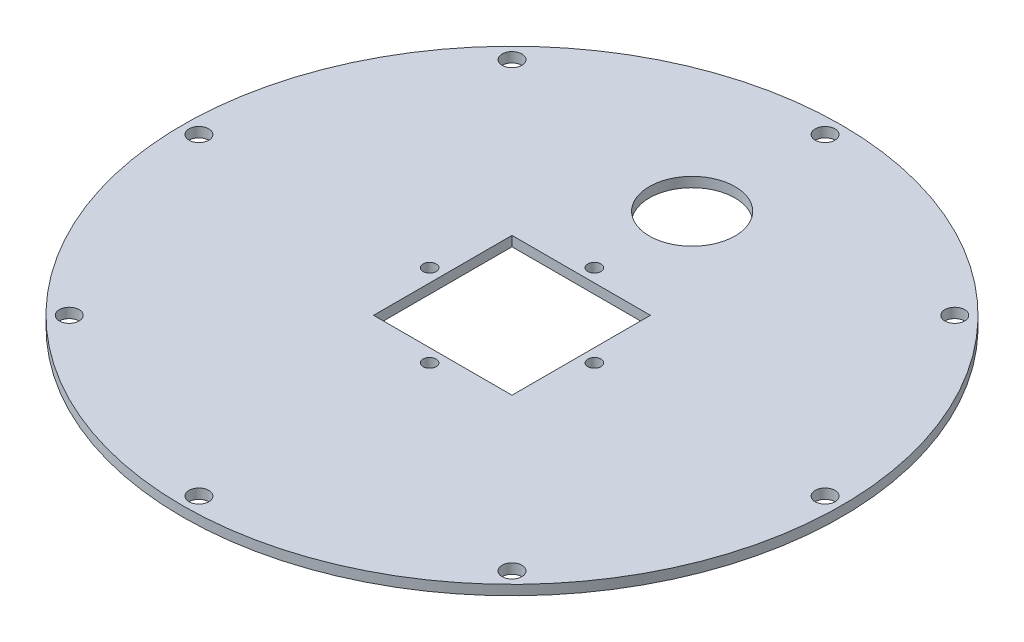
ISO-10303-21;
HEADER;
FILE_DESCRIPTION(('STEP AP214'),'2;1');
FILE_NAME('part.step','',(''),(''),'','','');
FILE_SCHEMA(('AUTOMOTIVE_DESIGN { 1 0 10303 214 1 1 1 1 }'));
ENDSEC;
DATA;
#1=APPLICATION_CONTEXT('core data for automotive mechanical design processes');
#2=APPLICATION_PROTOCOL_DEFINITION('international standard','automotive_design',2000,#1);
#3=PRODUCT_CONTEXT('',#1,'mechanical');
#4=PRODUCT('Part','Part','',(#3));
#5=PRODUCT_RELATED_PRODUCT_CATEGORY('part','',(#4));
#6=PRODUCT_DEFINITION_FORMATION('','',#4);
#7=PRODUCT_DEFINITION_CONTEXT('part definition',#1,'design');
#8=PRODUCT_DEFINITION('design','',#6,#7);
#9=PRODUCT_DEFINITION_SHAPE('','',#8);
#10=(LENGTH_UNIT() NAMED_UNIT(*) SI_UNIT(.MILLI.,.METRE.));
#11=(NAMED_UNIT(*) PLANE_ANGLE_UNIT() SI_UNIT($,.RADIAN.));
#12=(NAMED_UNIT(*) SI_UNIT($,.STERADIAN.) SOLID_ANGLE_UNIT());
#13=UNCERTAINTY_MEASURE_WITH_UNIT(LENGTH_MEASURE(1.E-05),#10,'distance_accuracy_value','');
#14=(GEOMETRIC_REPRESENTATION_CONTEXT(3) GLOBAL_UNCERTAINTY_ASSIGNED_CONTEXT((#13)) GLOBAL_UNIT_ASSIGNED_CONTEXT((#10,
#11,#12)) REPRESENTATION_CONTEXT('',''));
#15=CARTESIAN_POINT('',(0.,0.,0.));
#16=DIRECTION('',(0.,0.,1.));
#17=DIRECTION('',(1.,0.,0.));
#18=AXIS2_PLACEMENT_3D('',#15,#16,#17);
#19=CARTESIAN_POINT('',(0.,2.99999999999999,0.));
#20=DIRECTION('',(0.,1.,0.));
#21=DIRECTION('',(0.,0.,1.));
#22=AXIS2_PLACEMENT_3D('',#19,#20,#21);
#23=PLANE('',#22);
#24=CARTESIAN_POINT('',(0.,2.99999999999999,-54.6634614513246));
#25=DIRECTION('',(0.,1.,0.));
#26=DIRECTION('',(0.,0.,1.));
#27=AXIS2_PLACEMENT_3D('',#24,#25,#26);
#28=CIRCLE('',#27,13.);
#29=CARTESIAN_POINT('',(0.,2.99999999999999,-41.6634614513246));
#30=VERTEX_POINT('',#29);
#31=EDGE_CURVE('E198',#30,#30,#28,.T.);
#32=ORIENTED_EDGE('',*,*,#31,.F.);
#33=EDGE_LOOP('',(#32));
#34=FACE_BOUND('',#33,.T.);
#35=CARTESIAN_POINT('',(0.,2.99999999999999,25.));
#36=DIRECTION('',(0.,1.,0.));
#37=DIRECTION('',(0.,0.,1.));
#38=AXIS2_PLACEMENT_3D('',#35,#36,#37);
#39=CIRCLE('',#38,2.);
#40=CARTESIAN_POINT('',(0.,2.99999999999999,27.));
#41=VERTEX_POINT('',#40);
#42=EDGE_CURVE('E202',#41,#41,#39,.T.);
#43=ORIENTED_EDGE('',*,*,#42,.F.);
#44=EDGE_LOOP('',(#43));
#45=FACE_BOUND('',#44,.T.);
#46=CARTESIAN_POINT('',(-25.,2.99999999999999,0.));
#47=DIRECTION('',(0.,1.,0.));
#48=DIRECTION('',(0.,0.,1.));
#49=AXIS2_PLACEMENT_3D('',#46,#47,#48);
#50=CIRCLE('',#49,2.);
#51=CARTESIAN_POINT('',(-25.,2.99999999999999,2.00000000000001));
#52=VERTEX_POINT('',#51);
#53=EDGE_CURVE('E206',#52,#52,#50,.T.);
#54=ORIENTED_EDGE('',*,*,#53,.F.);
#55=EDGE_LOOP('',(#54));
#56=FACE_BOUND('',#55,.T.);
#57=CARTESIAN_POINT('',(0.,2.99999999999999,-25.));
#58=DIRECTION('',(0.,1.,0.));
#59=DIRECTION('',(0.,0.,1.));
#60=AXIS2_PLACEMENT_3D('',#57,#58,#59);
#61=CIRCLE('',#60,2.);
#62=CARTESIAN_POINT('',(0.,2.99999999999999,-23.));
#63=VERTEX_POINT('',#62);
#64=EDGE_CURVE('E210',#63,#63,#61,.T.);
#65=ORIENTED_EDGE('',*,*,#64,.F.);
#66=EDGE_LOOP('',(#65));
#67=FACE_BOUND('',#66,.T.);
#68=CARTESIAN_POINT('',(25.,2.99999999999999,0.));
#69=DIRECTION('',(0.,1.,0.));
#70=DIRECTION('',(0.,0.,1.));
#71=AXIS2_PLACEMENT_3D('',#68,#69,#70);
#72=CIRCLE('',#71,2.);
#73=CARTESIAN_POINT('',(25.,2.99999999999999,2.00000000000001));
#74=VERTEX_POINT('',#73);
#75=EDGE_CURVE('E214',#74,#74,#72,.T.);
#76=ORIENTED_EDGE('',*,*,#75,.F.);
#77=EDGE_LOOP('',(#76));
#78=FACE_BOUND('',#77,.T.);
#79=CARTESIAN_POINT('',(-67.1751204841119,2.99999999999999,67.175120484112));
#80=DIRECTION('',(0.,1.,0.));
#81=DIRECTION('',(0.,0.,1.));
#82=AXIS2_PLACEMENT_3D('',#79,#80,#81);
#83=CIRCLE('',#82,3.00000000000001);
#84=CARTESIAN_POINT('',(-67.1751204841119,2.99999999999999,70.175120484112));
#85=VERTEX_POINT('',#84);
#86=EDGE_CURVE('E217',#85,#85,#83,.T.);
#87=ORIENTED_EDGE('',*,*,#86,.F.);
#88=EDGE_LOOP('',(#87));
#89=FACE_BOUND('',#88,.T.);
#90=DIRECTION('',(1.,0.,0.));
#91=VECTOR('',#90,1.);
#92=CARTESIAN_POINT('',(21.,2.99999999999999,21.));
#93=LINE('',#92,#91);
#94=CARTESIAN_POINT('',(-21.,2.99999999999999,21.));
#95=VERTEX_POINT('',#94);
#96=CARTESIAN_POINT('',(21.,2.99999999999999,21.));
#97=VERTEX_POINT('',#96);
#98=EDGE_CURVE('E90',#95,#97,#93,.T.);
#99=ORIENTED_EDGE('',*,*,#98,.F.);
#100=DIRECTION('',(0.,0.,1.));
#101=VECTOR('',#100,1.);
#102=CARTESIAN_POINT('',(-21.,2.99999999999999,-21.));
#103=LINE('',#102,#101);
#104=CARTESIAN_POINT('',(-21.,2.99999999999999,-21.));
#105=VERTEX_POINT('',#104);
#106=EDGE_CURVE('E81',#105,#95,#103,.T.);
#107=ORIENTED_EDGE('',*,*,#106,.F.);
#108=DIRECTION('',(-1.,0.,0.));
#109=VECTOR('',#108,1.);
#110=CARTESIAN_POINT('',(21.,2.99999999999999,-21.));
#111=LINE('',#110,#109);
#112=CARTESIAN_POINT('',(21.,2.99999999999999,-21.));
#113=VERTEX_POINT('',#112);
#114=EDGE_CURVE('E108',#113,#105,#111,.T.);
#115=ORIENTED_EDGE('',*,*,#114,.F.);
#116=DIRECTION('',(0.,0.,-1.));
#117=VECTOR('',#116,1.);
#118=CARTESIAN_POINT('',(21.,2.99999999999999,-21.));
#119=LINE('',#118,#117);
#120=EDGE_CURVE('E104',#97,#113,#119,.T.);
#121=ORIENTED_EDGE('',*,*,#120,.F.);
#122=EDGE_LOOP('',(#99,#107,#115,#121));
#123=FACE_BOUND('',#122,.T.);
#124=CARTESIAN_POINT('',(67.175120484112,2.99999999999999,-67.175120484112));
#125=DIRECTION('',(0.,1.,0.));
#126=DIRECTION('',(0.,0.,1.));
#127=AXIS2_PLACEMENT_3D('',#124,#125,#126);
#128=CIRCLE('',#127,3.00000000000002);
#129=CARTESIAN_POINT('',(67.175120484112,2.99999999999999,-64.175120484112));
#130=VERTEX_POINT('',#129);
#131=EDGE_CURVE('E132',#130,#130,#128,.T.);
#132=ORIENTED_EDGE('',*,*,#131,.F.);
#133=EDGE_LOOP('',(#132));
#134=FACE_BOUND('',#133,.T.);
#135=CARTESIAN_POINT('',(-95.,2.99999999999999,0.));
#136=DIRECTION('',(0.,1.,0.));
#137=DIRECTION('',(0.,0.,1.));
#138=AXIS2_PLACEMENT_3D('',#135,#136,#137);
#139=CIRCLE('',#138,3.00000000000001);
#140=CARTESIAN_POINT('',(-95.,2.99999999999999,3.00000000000001));
#141=VERTEX_POINT('',#140);
#142=EDGE_CURVE('E148',#141,#141,#139,.T.);
#143=ORIENTED_EDGE('',*,*,#142,.F.);
#144=EDGE_LOOP('',(#143));
#145=FACE_BOUND('',#144,.T.);
#146=CARTESIAN_POINT('',(0.,2.99999999999999,95.));
#147=DIRECTION('',(0.,1.,0.));
#148=DIRECTION('',(0.,0.,1.));
#149=AXIS2_PLACEMENT_3D('',#146,#147,#148);
#150=CIRCLE('',#149,3.);
#151=CARTESIAN_POINT('',(0.,2.99999999999999,98.));
#152=VERTEX_POINT('',#151);
#153=EDGE_CURVE('E164',#152,#152,#150,.T.);
#154=ORIENTED_EDGE('',*,*,#153,.F.);
#155=EDGE_LOOP('',(#154));
#156=FACE_BOUND('',#155,.T.);
#157=CARTESIAN_POINT('',(0.,2.99999999999999,0.));
#158=DIRECTION('',(0.,1.,0.));
#159=DIRECTION('',(0.,0.,1.));
#160=AXIS2_PLACEMENT_3D('',#157,#158,#159);
#161=CIRCLE('',#160,100.);
#162=CARTESIAN_POINT('',(0.,2.99999999999999,100.));
#163=VERTEX_POINT('',#162);
#164=EDGE_CURVE('E11',#163,#163,#161,.T.);
#165=ORIENTED_EDGE('',*,*,#164,.T.);
#166=EDGE_LOOP('',(#165));
#167=FACE_BOUND('',#166,.T.);
#168=CARTESIAN_POINT('',(0.,2.99999999999999,-95.));
#169=DIRECTION('',(0.,1.,0.));
#170=DIRECTION('',(0.,0.,-1.));
#171=AXIS2_PLACEMENT_3D('',#168,#169,#170);
#172=CIRCLE('',#171,3.);
#173=CARTESIAN_POINT('',(0.,2.99999999999999,-98.));
#174=VERTEX_POINT('',#173);
#175=EDGE_CURVE('E156',#174,#174,#172,.T.);
#176=ORIENTED_EDGE('',*,*,#175,.F.);
#177=EDGE_LOOP('',(#176));
#178=FACE_BOUND('',#177,.T.);
#179=CARTESIAN_POINT('',(95.0000000000001,2.99999999999999,0.));
#180=DIRECTION('',(0.,1.,0.));
#181=DIRECTION('',(0.,0.,-1.));
#182=AXIS2_PLACEMENT_3D('',#179,#180,#181);
#183=CIRCLE('',#182,3.00000000000001);
#184=CARTESIAN_POINT('',(95.0000000000001,2.99999999999999,-3.00000000000001));
#185=VERTEX_POINT('',#184);
#186=EDGE_CURVE('E140',#185,#185,#183,.T.);
#187=ORIENTED_EDGE('',*,*,#186,.F.);
#188=EDGE_LOOP('',(#187));
#189=FACE_BOUND('',#188,.T.);
#190=CARTESIAN_POINT('',(67.175120484112,2.99999999999999,67.175120484112));
#191=DIRECTION('',(0.,1.,0.));
#192=DIRECTION('',(0.,0.,-1.));
#193=AXIS2_PLACEMENT_3D('',#190,#191,#192);
#194=CIRCLE('',#193,3.00000000000002);
#195=CARTESIAN_POINT('',(67.175120484112,2.99999999999999,64.175120484112));
#196=VERTEX_POINT('',#195);
#197=EDGE_CURVE('E116',#196,#196,#194,.T.);
#198=ORIENTED_EDGE('',*,*,#197,.F.);
#199=EDGE_LOOP('',(#198));
#200=FACE_BOUND('',#199,.T.);
#201=CARTESIAN_POINT('',(-67.1751204841119,2.99999999999999,-67.175120484112));
#202=DIRECTION('',(0.,1.,0.));
#203=DIRECTION('',(0.,0.,-1.));
#204=AXIS2_PLACEMENT_3D('',#201,#202,#203);
#205=CIRCLE('',#204,3.00000000000002);
#206=CARTESIAN_POINT('',(-67.1751204841119,2.99999999999999,-70.175120484112));
#207=VERTEX_POINT('',#206);
#208=EDGE_CURVE('E227',#207,#207,#205,.T.);
#209=ORIENTED_EDGE('',*,*,#208,.F.);
#210=EDGE_LOOP('',(#209));
#211=FACE_BOUND('',#210,.T.);
#212=ADVANCED_FACE('F39',(#34,#45,#56,#67,#78,#89,#123,#134,#145,#156,#167,#178,#189,#200,#211),
#23,.T.);
#213=CARTESIAN_POINT('',(0.,0.,0.));
#214=DIRECTION('',(0.,1.,0.));
#215=DIRECTION('',(0.,0.,1.));
#216=AXIS2_PLACEMENT_3D('',#213,#214,#215);
#217=PLANE('',#216);
#218=CARTESIAN_POINT('',(0.,0.,-54.6634614513246));
#219=DIRECTION('',(0.,1.,0.));
#220=DIRECTION('',(0.,0.,1.));
#221=AXIS2_PLACEMENT_3D('',#218,#219,#220);
#222=CIRCLE('',#221,13.);
#223=CARTESIAN_POINT('',(0.,0.,-41.6634614513246));
#224=VERTEX_POINT('',#223);
#225=EDGE_CURVE('E247',#224,#224,#222,.T.);
#226=ORIENTED_EDGE('',*,*,#225,.T.);
#227=EDGE_LOOP('',(#226));
#228=FACE_BOUND('',#227,.T.);
#229=CARTESIAN_POINT('',(0.,0.,25.));
#230=DIRECTION('',(0.,1.,0.));
#231=DIRECTION('',(0.,0.,1.));
#232=AXIS2_PLACEMENT_3D('',#229,#230,#231);
#233=CIRCLE('',#232,2.);
#234=CARTESIAN_POINT('',(0.,0.,27.));
#235=VERTEX_POINT('',#234);
#236=EDGE_CURVE('E264',#235,#235,#233,.T.);
#237=ORIENTED_EDGE('',*,*,#236,.T.);
#238=EDGE_LOOP('',(#237));
#239=FACE_BOUND('',#238,.T.);
#240=CARTESIAN_POINT('',(-25.,0.,0.));
#241=DIRECTION('',(0.,1.,0.));
#242=DIRECTION('',(0.,0.,1.));
#243=AXIS2_PLACEMENT_3D('',#240,#241,#242);
#244=CIRCLE('',#243,2.);
#245=CARTESIAN_POINT('',(-25.,0.,2.00000000000001));
#246=VERTEX_POINT('',#245);
#247=EDGE_CURVE('E252',#246,#246,#244,.T.);
#248=ORIENTED_EDGE('',*,*,#247,.T.);
#249=EDGE_LOOP('',(#248));
#250=FACE_BOUND('',#249,.T.);
#251=CARTESIAN_POINT('',(0.,0.,-25.));
#252=DIRECTION('',(0.,1.,0.));
#253=DIRECTION('',(0.,0.,1.));
#254=AXIS2_PLACEMENT_3D('',#251,#252,#253);
#255=CIRCLE('',#254,2.);
#256=CARTESIAN_POINT('',(0.,0.,-23.));
#257=VERTEX_POINT('',#256);
#258=EDGE_CURVE('E251',#257,#257,#255,.T.);
#259=ORIENTED_EDGE('',*,*,#258,.T.);
#260=EDGE_LOOP('',(#259));
#261=FACE_BOUND('',#260,.T.);
#262=CARTESIAN_POINT('',(25.,0.,0.));
#263=DIRECTION('',(0.,1.,0.));
#264=DIRECTION('',(0.,0.,1.));
#265=AXIS2_PLACEMENT_3D('',#262,#263,#264);
#266=CIRCLE('',#265,2.);
#267=CARTESIAN_POINT('',(25.,0.,2.00000000000001));
#268=VERTEX_POINT('',#267);
#269=EDGE_CURVE('E258',#268,#268,#266,.T.);
#270=ORIENTED_EDGE('',*,*,#269,.T.);
#271=EDGE_LOOP('',(#270));
#272=FACE_BOUND('',#271,.T.);
#273=CARTESIAN_POINT('',(67.175120484112,0.,-67.175120484112));
#274=DIRECTION('',(0.,1.,0.));
#275=DIRECTION('',(0.,0.,1.));
#276=AXIS2_PLACEMENT_3D('',#273,#274,#275);
#277=CIRCLE('',#276,3.00000000000002);
#278=CARTESIAN_POINT('',(67.175120484112,0.,-64.175120484112));
#279=VERTEX_POINT('',#278);
#280=EDGE_CURVE('E99',#279,#279,#277,.T.);
#281=ORIENTED_EDGE('',*,*,#280,.T.);
#282=EDGE_LOOP('',(#281));
#283=FACE_BOUND('',#282,.T.);
#284=CARTESIAN_POINT('',(95.0000000000001,0.,0.));
#285=DIRECTION('',(0.,1.,0.));
#286=DIRECTION('',(0.,0.,-1.));
#287=AXIS2_PLACEMENT_3D('',#284,#285,#286);
#288=CIRCLE('',#287,3.00000000000001);
#289=CARTESIAN_POINT('',(95.0000000000001,0.,-3.00000000000001));
#290=VERTEX_POINT('',#289);
#291=EDGE_CURVE('E136',#290,#290,#288,.T.);
#292=ORIENTED_EDGE('',*,*,#291,.T.);
#293=EDGE_LOOP('',(#292));
#294=FACE_BOUND('',#293,.T.);
#295=CARTESIAN_POINT('',(-95.,0.,0.));
#296=DIRECTION('',(0.,1.,0.));
#297=DIRECTION('',(0.,0.,1.));
#298=AXIS2_PLACEMENT_3D('',#295,#296,#297);
#299=CIRCLE('',#298,3.00000000000001);
#300=CARTESIAN_POINT('',(-95.,0.,3.00000000000001));
#301=VERTEX_POINT('',#300);
#302=EDGE_CURVE('E144',#301,#301,#299,.T.);
#303=ORIENTED_EDGE('',*,*,#302,.T.);
#304=EDGE_LOOP('',(#303));
#305=FACE_BOUND('',#304,.T.);
#306=CARTESIAN_POINT('',(0.,0.,-95.));
#307=DIRECTION('',(0.,1.,0.));
#308=DIRECTION('',(0.,0.,-1.));
#309=AXIS2_PLACEMENT_3D('',#306,#307,#308);
#310=CIRCLE('',#309,3.);
#311=CARTESIAN_POINT('',(0.,0.,-98.));
#312=VERTEX_POINT('',#311);
#313=EDGE_CURVE('E152',#312,#312,#310,.T.);
#314=ORIENTED_EDGE('',*,*,#313,.T.);
#315=EDGE_LOOP('',(#314));
#316=FACE_BOUND('',#315,.T.);
#317=CARTESIAN_POINT('',(0.,0.,95.));
#318=DIRECTION('',(0.,1.,0.));
#319=DIRECTION('',(0.,0.,1.));
#320=AXIS2_PLACEMENT_3D('',#317,#318,#319);
#321=CIRCLE('',#320,3.);
#322=CARTESIAN_POINT('',(0.,0.,98.));
#323=VERTEX_POINT('',#322);
#324=EDGE_CURVE('E160',#323,#323,#321,.T.);
#325=ORIENTED_EDGE('',*,*,#324,.T.);
#326=EDGE_LOOP('',(#325));
#327=FACE_BOUND('',#326,.T.);
#328=CARTESIAN_POINT('',(0.,0.,0.));
#329=DIRECTION('',(0.,1.,0.));
#330=DIRECTION('',(0.,0.,1.));
#331=AXIS2_PLACEMENT_3D('',#328,#329,#330);
#332=CIRCLE('',#331,100.);
#333=CARTESIAN_POINT('',(0.,0.,100.));
#334=VERTEX_POINT('',#333);
#335=EDGE_CURVE('E43',#334,#334,#332,.T.);
#336=ORIENTED_EDGE('',*,*,#335,.F.);
#337=EDGE_LOOP('',(#336));
#338=FACE_BOUND('',#337,.T.);
#339=DIRECTION('',(0.,0.,1.));
#340=VECTOR('',#339,1.);
#341=CARTESIAN_POINT('',(-21.,0.,-21.));
#342=LINE('',#341,#340);
#343=CARTESIAN_POINT('',(-21.,0.,-21.));
#344=VERTEX_POINT('',#343);
#345=CARTESIAN_POINT('',(-21.,0.,21.));
#346=VERTEX_POINT('',#345);
#347=EDGE_CURVE('E63',#344,#346,#342,.T.);
#348=ORIENTED_EDGE('',*,*,#347,.T.);
#349=DIRECTION('',(1.,0.,0.));
#350=VECTOR('',#349,1.);
#351=CARTESIAN_POINT('',(21.,0.,21.));
#352=LINE('',#351,#350);
#353=CARTESIAN_POINT('',(21.,0.,21.));
#354=VERTEX_POINT('',#353);
#355=EDGE_CURVE('E97',#346,#354,#352,.T.);
#356=ORIENTED_EDGE('',*,*,#355,.T.);
#357=DIRECTION('',(0.,0.,-1.));
#358=VECTOR('',#357,1.);
#359=CARTESIAN_POINT('',(21.,0.,-21.));
#360=LINE('',#359,#358);
#361=CARTESIAN_POINT('',(21.,0.,-21.));
#362=VERTEX_POINT('',#361);
#363=EDGE_CURVE('E119',#354,#362,#360,.T.);
#364=ORIENTED_EDGE('',*,*,#363,.T.);
#365=DIRECTION('',(-1.,0.,0.));
#366=VECTOR('',#365,1.);
#367=CARTESIAN_POINT('',(21.,0.,-21.));
#368=LINE('',#367,#366);
#369=EDGE_CURVE('E91',#362,#344,#368,.T.);
#370=ORIENTED_EDGE('',*,*,#369,.T.);
#371=EDGE_LOOP('',(#348,#356,#364,#370));
#372=FACE_BOUND('',#371,.T.);
#373=CARTESIAN_POINT('',(67.175120484112,0.,67.175120484112));
#374=DIRECTION('',(0.,1.,0.));
#375=DIRECTION('',(0.,0.,-1.));
#376=AXIS2_PLACEMENT_3D('',#373,#374,#375);
#377=CIRCLE('',#376,3.00000000000002);
#378=CARTESIAN_POINT('',(67.175120484112,0.,64.175120484112));
#379=VERTEX_POINT('',#378);
#380=EDGE_CURVE('E220',#379,#379,#377,.T.);
#381=ORIENTED_EDGE('',*,*,#380,.T.);
#382=EDGE_LOOP('',(#381));
#383=FACE_BOUND('',#382,.T.);
#384=CARTESIAN_POINT('',(-67.1751204841119,0.,67.175120484112));
#385=DIRECTION('',(0.,1.,0.));
#386=DIRECTION('',(0.,0.,1.));
#387=AXIS2_PLACEMENT_3D('',#384,#385,#386);
#388=CIRCLE('',#387,3.00000000000001);
#389=CARTESIAN_POINT('',(-67.1751204841119,0.,70.175120484112));
#390=VERTEX_POINT('',#389);
#391=EDGE_CURVE('E221',#390,#390,#388,.T.);
#392=ORIENTED_EDGE('',*,*,#391,.T.);
#393=EDGE_LOOP('',(#392));
#394=FACE_BOUND('',#393,.T.);
#395=CARTESIAN_POINT('',(-67.1751204841119,0.,-67.175120484112));
#396=DIRECTION('',(0.,1.,0.));
#397=DIRECTION('',(0.,0.,-1.));
#398=AXIS2_PLACEMENT_3D('',#395,#396,#397);
#399=CIRCLE('',#398,3.00000000000002);
#400=CARTESIAN_POINT('',(-67.1751204841119,0.,-70.175120484112));
#401=VERTEX_POINT('',#400);
#402=EDGE_CURVE('E230',#401,#401,#399,.T.);
#403=ORIENTED_EDGE('',*,*,#402,.T.);
#404=EDGE_LOOP('',(#403));
#405=FACE_BOUND('',#404,.T.);
#406=ADVANCED_FACE('F172',(#228,#239,#250,#261,#272,#283,#294,#305,#316,#327,#338,#372,#383,
#394,#405),#217,.F.);
#407=CARTESIAN_POINT('',(0.,2.99999999999999,0.));
#408=DIRECTION('',(0.,-1.,0.));
#409=DIRECTION('',(0.,0.,-1.));
#410=AXIS2_PLACEMENT_3D('',#407,#408,#409);
#411=CYLINDRICAL_SURFACE('',#410,100.);
#412=ORIENTED_EDGE('',*,*,#164,.F.);
#413=EDGE_LOOP('',(#412));
#414=FACE_BOUND('',#413,.T.);
#415=ORIENTED_EDGE('',*,*,#335,.T.);
#416=EDGE_LOOP('',(#415));
#417=FACE_BOUND('',#416,.T.);
#418=ADVANCED_FACE('F41',(#414,#417),#411,.T.);
#419=CARTESIAN_POINT('',(0.,2.99999999999999,95.));
#420=DIRECTION('',(0.,-1.,0.));
#421=DIRECTION('',(0.,0.,-1.));
#422=AXIS2_PLACEMENT_3D('',#419,#420,#421);
#423=CYLINDRICAL_SURFACE('',#422,3.);
#424=ORIENTED_EDGE('',*,*,#153,.T.);
#425=EDGE_LOOP('',(#424));
#426=FACE_BOUND('',#425,.T.);
#427=ORIENTED_EDGE('',*,*,#324,.F.);
#428=EDGE_LOOP('',(#427));
#429=FACE_BOUND('',#428,.T.);
#430=ADVANCED_FACE('F175',(#426,#429),#423,.F.);
#431=CARTESIAN_POINT('',(0.,2.99999999999999,-95.));
#432=DIRECTION('',(0.,-1.,0.));
#433=DIRECTION('',(0.,0.,-1.));
#434=AXIS2_PLACEMENT_3D('',#431,#432,#433);
#435=CYLINDRICAL_SURFACE('',#434,3.);
#436=ORIENTED_EDGE('',*,*,#175,.T.);
#437=EDGE_LOOP('',(#436));
#438=FACE_BOUND('',#437,.T.);
#439=ORIENTED_EDGE('',*,*,#313,.F.);
#440=EDGE_LOOP('',(#439));
#441=FACE_BOUND('',#440,.T.);
#442=ADVANCED_FACE('F177',(#438,#441),#435,.F.);
#443=CARTESIAN_POINT('',(-95.,2.99999999999999,0.));
#444=DIRECTION('',(0.,-1.,0.));
#445=DIRECTION('',(0.,0.,-1.));
#446=AXIS2_PLACEMENT_3D('',#443,#444,#445);
#447=CYLINDRICAL_SURFACE('',#446,3.00000000000001);
#448=ORIENTED_EDGE('',*,*,#142,.T.);
#449=EDGE_LOOP('',(#448));
#450=FACE_BOUND('',#449,.T.);
#451=ORIENTED_EDGE('',*,*,#302,.F.);
#452=EDGE_LOOP('',(#451));
#453=FACE_BOUND('',#452,.T.);
#454=ADVANCED_FACE('F184',(#450,#453),#447,.F.);
#455=CARTESIAN_POINT('',(95.0000000000001,2.99999999999999,0.));
#456=DIRECTION('',(0.,-1.,0.));
#457=DIRECTION('',(0.,0.,-1.));
#458=AXIS2_PLACEMENT_3D('',#455,#456,#457);
#459=CYLINDRICAL_SURFACE('',#458,3.00000000000001);
#460=ORIENTED_EDGE('',*,*,#186,.T.);
#461=EDGE_LOOP('',(#460));
#462=FACE_BOUND('',#461,.T.);
#463=ORIENTED_EDGE('',*,*,#291,.F.);
#464=EDGE_LOOP('',(#463));
#465=FACE_BOUND('',#464,.T.);
#466=ADVANCED_FACE('F325',(#462,#465),#459,.F.);
#467=CARTESIAN_POINT('',(67.175120484112,2.99999999999999,-67.175120484112));
#468=DIRECTION('',(0.,-1.,0.));
#469=DIRECTION('',(0.,0.,-1.));
#470=AXIS2_PLACEMENT_3D('',#467,#468,#469);
#471=CYLINDRICAL_SURFACE('',#470,3.00000000000002);
#472=ORIENTED_EDGE('',*,*,#131,.T.);
#473=EDGE_LOOP('',(#472));
#474=FACE_BOUND('',#473,.T.);
#475=ORIENTED_EDGE('',*,*,#280,.F.);
#476=EDGE_LOOP('',(#475));
#477=FACE_BOUND('',#476,.T.);
#478=ADVANCED_FACE('F322',(#474,#477),#471,.F.);
#479=CARTESIAN_POINT('',(-21.,2.99999999999999,-21.));
#480=DIRECTION('',(1.,0.,0.));
#481=DIRECTION('',(0.,0.,-1.));
#482=AXIS2_PLACEMENT_3D('',#479,#480,#481);
#483=PLANE('',#482);
#484=ORIENTED_EDGE('',*,*,#347,.F.);
#485=DIRECTION('',(0.,-1.,0.));
#486=VECTOR('',#485,1.);
#487=CARTESIAN_POINT('',(-21.,2.99999999999999,-21.));
#488=LINE('',#487,#486);
#489=EDGE_CURVE('E85',#105,#344,#488,.T.);
#490=ORIENTED_EDGE('',*,*,#489,.F.);
#491=ORIENTED_EDGE('',*,*,#106,.T.);
#492=DIRECTION('',(0.,-1.,0.));
#493=VECTOR('',#492,1.);
#494=CARTESIAN_POINT('',(-21.,2.99999999999999,21.));
#495=LINE('',#494,#493);
#496=EDGE_CURVE('E84',#95,#346,#495,.T.);
#497=ORIENTED_EDGE('',*,*,#496,.T.);
#498=EDGE_LOOP('',(#484,#490,#491,#497));
#499=FACE_BOUND('',#498,.T.);
#500=ADVANCED_FACE('F83',(#499),#483,.T.);
#501=CARTESIAN_POINT('',(21.,2.99999999999999,21.));
#502=DIRECTION('',(0.,0.,-1.));
#503=DIRECTION('',(-1.,0.,0.));
#504=AXIS2_PLACEMENT_3D('',#501,#502,#503);
#505=PLANE('',#504);
#506=ORIENTED_EDGE('',*,*,#355,.F.);
#507=ORIENTED_EDGE('',*,*,#496,.F.);
#508=ORIENTED_EDGE('',*,*,#98,.T.);
#509=DIRECTION('',(0.,-1.,0.));
#510=VECTOR('',#509,1.);
#511=CARTESIAN_POINT('',(21.,2.99999999999999,21.));
#512=LINE('',#511,#510);
#513=EDGE_CURVE('E100',#97,#354,#512,.T.);
#514=ORIENTED_EDGE('',*,*,#513,.T.);
#515=EDGE_LOOP('',(#506,#507,#508,#514));
#516=FACE_BOUND('',#515,.T.);
#517=ADVANCED_FACE('F94',(#516),#505,.T.);
#518=CARTESIAN_POINT('',(21.,2.99999999999999,-21.));
#519=DIRECTION('',(-1.,0.,0.));
#520=DIRECTION('',(0.,0.,1.));
#521=AXIS2_PLACEMENT_3D('',#518,#519,#520);
#522=PLANE('',#521);
#523=ORIENTED_EDGE('',*,*,#363,.F.);
#524=ORIENTED_EDGE('',*,*,#513,.F.);
#525=ORIENTED_EDGE('',*,*,#120,.T.);
#526=DIRECTION('',(0.,-1.,0.));
#527=VECTOR('',#526,1.);
#528=CARTESIAN_POINT('',(21.,2.99999999999999,-21.));
#529=LINE('',#528,#527);
#530=EDGE_CURVE('E55',#113,#362,#529,.T.);
#531=ORIENTED_EDGE('',*,*,#530,.T.);
#532=EDGE_LOOP('',(#523,#524,#525,#531));
#533=FACE_BOUND('',#532,.T.);
#534=ADVANCED_FACE('F314',(#533),#522,.T.);
#535=CARTESIAN_POINT('',(21.,2.99999999999999,-21.));
#536=DIRECTION('',(0.,0.,1.));
#537=DIRECTION('',(1.,0.,0.));
#538=AXIS2_PLACEMENT_3D('',#535,#536,#537);
#539=PLANE('',#538);
#540=ORIENTED_EDGE('',*,*,#369,.F.);
#541=ORIENTED_EDGE('',*,*,#530,.F.);
#542=ORIENTED_EDGE('',*,*,#114,.T.);
#543=ORIENTED_EDGE('',*,*,#489,.T.);
#544=EDGE_LOOP('',(#540,#541,#542,#543));
#545=FACE_BOUND('',#544,.T.);
#546=ADVANCED_FACE('F311',(#545),#539,.T.);
#547=CARTESIAN_POINT('',(67.175120484112,2.99999999999999,67.175120484112));
#548=DIRECTION('',(0.,-1.,0.));
#549=DIRECTION('',(0.,0.,-1.));
#550=AXIS2_PLACEMENT_3D('',#547,#548,#549);
#551=CYLINDRICAL_SURFACE('',#550,3.00000000000002);
#552=ORIENTED_EDGE('',*,*,#197,.T.);
#553=EDGE_LOOP('',(#552));
#554=FACE_BOUND('',#553,.T.);
#555=ORIENTED_EDGE('',*,*,#380,.F.);
#556=EDGE_LOOP('',(#555));
#557=FACE_BOUND('',#556,.T.);
#558=ADVANCED_FACE('F237',(#554,#557),#551,.F.);
#559=CARTESIAN_POINT('',(-67.1751204841119,2.99999999999999,67.175120484112));
#560=DIRECTION('',(0.,-1.,0.));
#561=DIRECTION('',(0.,0.,-1.));
#562=AXIS2_PLACEMENT_3D('',#559,#560,#561);
#563=CYLINDRICAL_SURFACE('',#562,3.00000000000001);
#564=ORIENTED_EDGE('',*,*,#86,.T.);
#565=EDGE_LOOP('',(#564));
#566=FACE_BOUND('',#565,.T.);
#567=ORIENTED_EDGE('',*,*,#391,.F.);
#568=EDGE_LOOP('',(#567));
#569=FACE_BOUND('',#568,.T.);
#570=ADVANCED_FACE('F306',(#566,#569),#563,.F.);
#571=CARTESIAN_POINT('',(-67.1751204841119,2.99999999999999,-67.175120484112));
#572=DIRECTION('',(0.,-1.,0.));
#573=DIRECTION('',(0.,0.,-1.));
#574=AXIS2_PLACEMENT_3D('',#571,#572,#573);
#575=CYLINDRICAL_SURFACE('',#574,3.00000000000002);
#576=ORIENTED_EDGE('',*,*,#208,.T.);
#577=EDGE_LOOP('',(#576));
#578=FACE_BOUND('',#577,.T.);
#579=ORIENTED_EDGE('',*,*,#402,.F.);
#580=EDGE_LOOP('',(#579));
#581=FACE_BOUND('',#580,.T.);
#582=ADVANCED_FACE('F299',(#578,#581),#575,.F.);
#583=CARTESIAN_POINT('',(25.,0.,0.));
#584=DIRECTION('',(0.,1.,0.));
#585=DIRECTION('',(0.,0.,1.));
#586=AXIS2_PLACEMENT_3D('',#583,#584,#585);
#587=CYLINDRICAL_SURFACE('',#586,2.);
#588=ORIENTED_EDGE('',*,*,#269,.F.);
#589=EDGE_LOOP('',(#588));
#590=FACE_BOUND('',#589,.T.);
#591=ORIENTED_EDGE('',*,*,#75,.T.);
#592=EDGE_LOOP('',(#591));
#593=FACE_BOUND('',#592,.T.);
#594=ADVANCED_FACE('F296',(#590,#593),#587,.F.);
#595=CARTESIAN_POINT('',(0.,0.,-25.));
#596=DIRECTION('',(0.,1.,0.));
#597=DIRECTION('',(0.,0.,1.));
#598=AXIS2_PLACEMENT_3D('',#595,#596,#597);
#599=CYLINDRICAL_SURFACE('',#598,2.);
#600=ORIENTED_EDGE('',*,*,#258,.F.);
#601=EDGE_LOOP('',(#600));
#602=FACE_BOUND('',#601,.T.);
#603=ORIENTED_EDGE('',*,*,#64,.T.);
#604=EDGE_LOOP('',(#603));
#605=FACE_BOUND('',#604,.T.);
#606=ADVANCED_FACE('F293',(#602,#605),#599,.F.);
#607=CARTESIAN_POINT('',(-25.,0.,0.));
#608=DIRECTION('',(0.,1.,0.));
#609=DIRECTION('',(0.,0.,1.));
#610=AXIS2_PLACEMENT_3D('',#607,#608,#609);
#611=CYLINDRICAL_SURFACE('',#610,2.);
#612=ORIENTED_EDGE('',*,*,#247,.F.);
#613=EDGE_LOOP('',(#612));
#614=FACE_BOUND('',#613,.T.);
#615=ORIENTED_EDGE('',*,*,#53,.T.);
#616=EDGE_LOOP('',(#615));
#617=FACE_BOUND('',#616,.T.);
#618=ADVANCED_FACE('F288',(#614,#617),#611,.F.);
#619=CARTESIAN_POINT('',(0.,0.,25.));
#620=DIRECTION('',(0.,1.,0.));
#621=DIRECTION('',(0.,0.,1.));
#622=AXIS2_PLACEMENT_3D('',#619,#620,#621);
#623=CYLINDRICAL_SURFACE('',#622,2.);
#624=ORIENTED_EDGE('',*,*,#236,.F.);
#625=EDGE_LOOP('',(#624));
#626=FACE_BOUND('',#625,.T.);
#627=ORIENTED_EDGE('',*,*,#42,.T.);
#628=EDGE_LOOP('',(#627));
#629=FACE_BOUND('',#628,.T.);
#630=ADVANCED_FACE('F283',(#626,#629),#623,.F.);
#631=CARTESIAN_POINT('',(0.,0.,-54.6634614513246));
#632=DIRECTION('',(0.,1.,0.));
#633=DIRECTION('',(0.,0.,1.));
#634=AXIS2_PLACEMENT_3D('',#631,#632,#633);
#635=CYLINDRICAL_SURFACE('',#634,13.);
#636=ORIENTED_EDGE('',*,*,#225,.F.);
#637=EDGE_LOOP('',(#636));
#638=FACE_BOUND('',#637,.T.);
#639=ORIENTED_EDGE('',*,*,#31,.T.);
#640=EDGE_LOOP('',(#639));
#641=FACE_BOUND('',#640,.T.);
#642=ADVANCED_FACE('F280',(#638,#641),#635,.F.);
#643=CLOSED_SHELL('',(#212,#406,#418,#430,#442,#454,#466,#478,#500,#517,#534,#546,#558,#570,
#582,#594,#606,#618,#630,#642));
#644=MANIFOLD_SOLID_BREP('B2',#643);
#645=ADVANCED_BREP_SHAPE_REPRESENTATION('',(#18,#644),#14);
#646=SHAPE_DEFINITION_REPRESENTATION(#9,#645);
ENDSEC;
END-ISO-10303-21;
